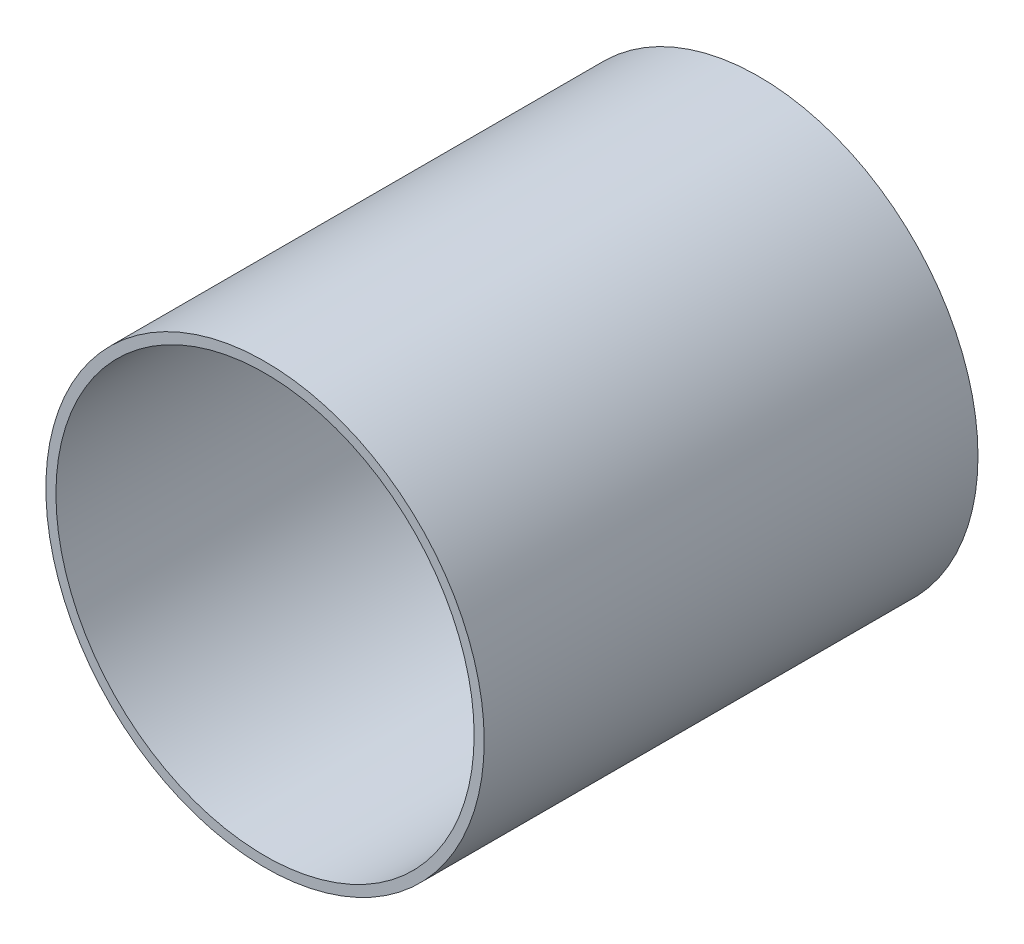
ISO-10303-21;
HEADER;
FILE_DESCRIPTION(('STEP AP214'),'2;1');
FILE_NAME('part.step','',(''),(''),'','','');
FILE_SCHEMA(('AUTOMOTIVE_DESIGN { 1 0 10303 214 1 1 1 1 }'));
ENDSEC;
DATA;
#1=APPLICATION_CONTEXT('core data for automotive mechanical design processes');
#2=APPLICATION_PROTOCOL_DEFINITION('international standard','automotive_design',2000,#1);
#3=PRODUCT_CONTEXT('',#1,'mechanical');
#4=PRODUCT('Part','Part','',(#3));
#5=PRODUCT_RELATED_PRODUCT_CATEGORY('part','',(#4));
#6=PRODUCT_DEFINITION_FORMATION('','',#4);
#7=PRODUCT_DEFINITION_CONTEXT('part definition',#1,'design');
#8=PRODUCT_DEFINITION('design','',#6,#7);
#9=PRODUCT_DEFINITION_SHAPE('','',#8);
#10=(LENGTH_UNIT() NAMED_UNIT(*) SI_UNIT(.MILLI.,.METRE.));
#11=(NAMED_UNIT(*) PLANE_ANGLE_UNIT() SI_UNIT($,.RADIAN.));
#12=(NAMED_UNIT(*) SI_UNIT($,.STERADIAN.) SOLID_ANGLE_UNIT());
#13=UNCERTAINTY_MEASURE_WITH_UNIT(LENGTH_MEASURE(1.E-05),#10,'distance_accuracy_value','');
#14=(GEOMETRIC_REPRESENTATION_CONTEXT(3) GLOBAL_UNCERTAINTY_ASSIGNED_CONTEXT((#13)) GLOBAL_UNIT_ASSIGNED_CONTEXT((#10,
#11,#12)) REPRESENTATION_CONTEXT('',''));
#15=CARTESIAN_POINT('',(0.,0.,0.));
#16=DIRECTION('',(0.,0.,1.));
#17=DIRECTION('',(1.,0.,0.));
#18=AXIS2_PLACEMENT_3D('',#15,#16,#17);
#19=CARTESIAN_POINT('',(0.,0.,98.));
#20=DIRECTION('',(0.,0.,-1.));
#21=DIRECTION('',(-1.,0.,0.));
#22=AXIS2_PLACEMENT_3D('',#19,#20,#21);
#23=CYLINDRICAL_SURFACE('',#22,41.5);
#24=CARTESIAN_POINT('',(0.,0.,98.));
#25=DIRECTION('',(0.,0.,1.));
#26=DIRECTION('',(1.,0.,0.));
#27=AXIS2_PLACEMENT_3D('',#24,#25,#26);
#28=CIRCLE('',#27,41.5);
#29=CARTESIAN_POINT('',(41.5,0.,98.));
#30=VERTEX_POINT('',#29);
#31=EDGE_CURVE('E42',#30,#30,#28,.T.);
#32=ORIENTED_EDGE('',*,*,#31,.T.);
#33=EDGE_LOOP('',(#32));
#34=FACE_BOUND('',#33,.T.);
#35=CARTESIAN_POINT('',(0.,0.,9.));
#36=DIRECTION('',(0.,0.,-1.));
#37=DIRECTION('',(-1.,0.,0.));
#38=AXIS2_PLACEMENT_3D('',#35,#36,#37);
#39=CIRCLE('',#38,41.5);
#40=CARTESIAN_POINT('',(-41.5,0.,9.));
#41=VERTEX_POINT('',#40);
#42=EDGE_CURVE('E46',#41,#41,#39,.T.);
#43=ORIENTED_EDGE('',*,*,#42,.T.);
#44=EDGE_LOOP('',(#43));
#45=FACE_BOUND('',#44,.T.);
#46=ADVANCED_FACE('F31',(#34,#45),#23,.F.);
#47=CARTESIAN_POINT('',(0.,0.,98.));
#48=DIRECTION('',(0.,0.,1.));
#49=DIRECTION('',(1.,0.,0.));
#50=AXIS2_PLACEMENT_3D('',#47,#48,#49);
#51=PLANE('',#50);
#52=CARTESIAN_POINT('',(0.,0.,98.));
#53=DIRECTION('',(0.,0.,1.));
#54=DIRECTION('',(1.,0.,0.));
#55=AXIS2_PLACEMENT_3D('',#52,#53,#54);
#56=CIRCLE('',#55,43.5);
#57=CARTESIAN_POINT('',(43.5,0.,98.));
#58=VERTEX_POINT('',#57);
#59=EDGE_CURVE('E10',#58,#58,#56,.T.);
#60=ORIENTED_EDGE('',*,*,#59,.T.);
#61=EDGE_LOOP('',(#60));
#62=FACE_BOUND('',#61,.T.);
#63=ORIENTED_EDGE('',*,*,#31,.F.);
#64=EDGE_LOOP('',(#63));
#65=FACE_BOUND('',#64,.T.);
#66=ADVANCED_FACE('F61',(#62,#65),#51,.T.);
#67=CARTESIAN_POINT('',(0.,0.,0.));
#68=DIRECTION('',(0.,0.,1.));
#69=DIRECTION('',(1.,0.,0.));
#70=AXIS2_PLACEMENT_3D('',#67,#68,#69);
#71=PLANE('',#70);
#72=CARTESIAN_POINT('',(0.,0.,0.));
#73=DIRECTION('',(0.,0.,1.));
#74=DIRECTION('',(1.,0.,0.));
#75=AXIS2_PLACEMENT_3D('',#72,#73,#74);
#76=CIRCLE('',#75,43.5);
#77=CARTESIAN_POINT('',(43.5,0.,0.));
#78=VERTEX_POINT('',#77);
#79=EDGE_CURVE('E35',#78,#78,#76,.T.);
#80=ORIENTED_EDGE('',*,*,#79,.F.);
#81=EDGE_LOOP('',(#80));
#82=FACE_BOUND('',#81,.T.);
#83=ADVANCED_FACE('F57',(#82),#71,.F.);
#84=CARTESIAN_POINT('',(0.,0.,98.));
#85=DIRECTION('',(0.,0.,-1.));
#86=DIRECTION('',(-1.,0.,0.));
#87=AXIS2_PLACEMENT_3D('',#84,#85,#86);
#88=CYLINDRICAL_SURFACE('',#87,43.5);
#89=ORIENTED_EDGE('',*,*,#59,.F.);
#90=EDGE_LOOP('',(#89));
#91=FACE_BOUND('',#90,.T.);
#92=ORIENTED_EDGE('',*,*,#79,.T.);
#93=EDGE_LOOP('',(#92));
#94=FACE_BOUND('',#93,.T.);
#95=ADVANCED_FACE('F33',(#91,#94),#88,.T.);
#96=CARTESIAN_POINT('',(0.,0.,9.));
#97=DIRECTION('',(0.,0.,-1.));
#98=DIRECTION('',(-1.,0.,0.));
#99=AXIS2_PLACEMENT_3D('',#96,#97,#98);
#100=PLANE('',#99);
#101=ORIENTED_EDGE('',*,*,#42,.F.);
#102=EDGE_LOOP('',(#101));
#103=FACE_BOUND('',#102,.T.);
#104=ADVANCED_FACE('F51',(#103),#100,.F.);
#105=CLOSED_SHELL('',(#46,#66,#83,#95,#104));
#106=MANIFOLD_SOLID_BREP('B2',#105);
#107=ADVANCED_BREP_SHAPE_REPRESENTATION('',(#18,#106),#14);
#108=SHAPE_DEFINITION_REPRESENTATION(#9,#107);
ENDSEC;
END-ISO-10303-21;
